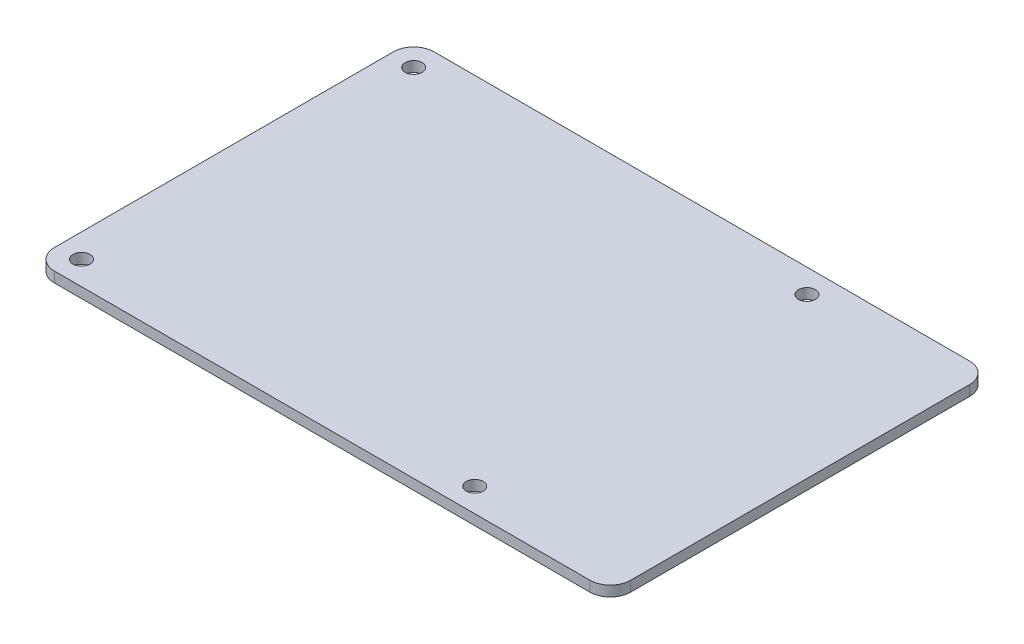
ISO-10303-21;
HEADER;
FILE_DESCRIPTION(('STEP AP214'),'2;1');
FILE_NAME('part.step','',(''),(''),'','','');
FILE_SCHEMA(('AUTOMOTIVE_DESIGN { 1 0 10303 214 1 1 1 1 }'));
ENDSEC;
DATA;
#1=APPLICATION_CONTEXT('core data for automotive mechanical design processes');
#2=APPLICATION_PROTOCOL_DEFINITION('international standard','automotive_design',2000,#1);
#3=PRODUCT_CONTEXT('',#1,'mechanical');
#4=PRODUCT('Part','Part','',(#3));
#5=PRODUCT_RELATED_PRODUCT_CATEGORY('part','',(#4));
#6=PRODUCT_DEFINITION_FORMATION('','',#4);
#7=PRODUCT_DEFINITION_CONTEXT('part definition',#1,'design');
#8=PRODUCT_DEFINITION('design','',#6,#7);
#9=PRODUCT_DEFINITION_SHAPE('','',#8);
#10=(LENGTH_UNIT() NAMED_UNIT(*) SI_UNIT(.MILLI.,.METRE.));
#11=(NAMED_UNIT(*) PLANE_ANGLE_UNIT() SI_UNIT($,.RADIAN.));
#12=(NAMED_UNIT(*) SI_UNIT($,.STERADIAN.) SOLID_ANGLE_UNIT());
#13=UNCERTAINTY_MEASURE_WITH_UNIT(LENGTH_MEASURE(1.E-05),#10,'distance_accuracy_value','');
#14=(GEOMETRIC_REPRESENTATION_CONTEXT(3) GLOBAL_UNCERTAINTY_ASSIGNED_CONTEXT((#13)) GLOBAL_UNIT_ASSIGNED_CONTEXT((#10,
#11,#12)) REPRESENTATION_CONTEXT('',''));
#15=CARTESIAN_POINT('',(0.,0.,0.));
#16=DIRECTION('',(0.,0.,1.));
#17=DIRECTION('',(1.,0.,0.));
#18=AXIS2_PLACEMENT_3D('',#15,#16,#17);
#19=CARTESIAN_POINT('',(0.,1.524,0.));
#20=DIRECTION('',(0.,-1.,0.));
#21=DIRECTION('',(0.,0.,-1.));
#22=AXIS2_PLACEMENT_3D('',#19,#20,#21);
#23=PLANE('',#22);
#24=DIRECTION('',(-1.,0.,0.));
#25=VECTOR('',#24,1.);
#26=CARTESIAN_POINT('',(0.,1.524,-56.));
#27=LINE('',#26,#25);
#28=CARTESIAN_POINT('',(82.,1.524,-56.));
#29=VERTEX_POINT('',#28);
#30=CARTESIAN_POINT('',(3.,1.524,-56.));
#31=VERTEX_POINT('',#30);
#32=EDGE_CURVE('E135',#29,#31,#27,.T.);
#33=ORIENTED_EDGE('',*,*,#32,.T.);
#34=CARTESIAN_POINT('',(3.,1.524,-53.));
#35=DIRECTION('',(0.,-1.,0.));
#36=DIRECTION('',(0.,0.,-1.));
#37=AXIS2_PLACEMENT_3D('',#34,#35,#36);
#38=CIRCLE('',#37,3.);
#39=CARTESIAN_POINT('',(0.,1.524,-53.));
#40=VERTEX_POINT('',#39);
#41=EDGE_CURVE('E154',#31,#40,#38,.F.);
#42=ORIENTED_EDGE('',*,*,#41,.T.);
#43=DIRECTION('',(0.,0.,1.));
#44=VECTOR('',#43,1.);
#45=CARTESIAN_POINT('',(0.,1.524,0.));
#46=LINE('',#45,#44);
#47=CARTESIAN_POINT('',(0.,1.524,-3.));
#48=VERTEX_POINT('',#47);
#49=EDGE_CURVE('E118',#40,#48,#46,.T.);
#50=ORIENTED_EDGE('',*,*,#49,.T.);
#51=CARTESIAN_POINT('',(3.,1.524,-3.));
#52=DIRECTION('',(0.,-1.,0.));
#53=DIRECTION('',(0.,0.,-1.));
#54=AXIS2_PLACEMENT_3D('',#51,#52,#53);
#55=CIRCLE('',#54,3.);
#56=CARTESIAN_POINT('',(3.,1.524,0.));
#57=VERTEX_POINT('',#56);
#58=EDGE_CURVE('E149',#48,#57,#55,.F.);
#59=ORIENTED_EDGE('',*,*,#58,.T.);
#60=DIRECTION('',(1.,0.,0.));
#61=VECTOR('',#60,1.);
#62=CARTESIAN_POINT('',(0.,1.524,0.));
#63=LINE('',#62,#61);
#64=CARTESIAN_POINT('',(82.,1.524,0.));
#65=VERTEX_POINT('',#64);
#66=EDGE_CURVE('E165',#57,#65,#63,.T.);
#67=ORIENTED_EDGE('',*,*,#66,.T.);
#68=CARTESIAN_POINT('',(82.,1.524,-3.));
#69=DIRECTION('',(0.,-1.,0.));
#70=DIRECTION('',(0.,0.,-1.));
#71=AXIS2_PLACEMENT_3D('',#68,#69,#70);
#72=CIRCLE('',#71,3.);
#73=CARTESIAN_POINT('',(85.,1.524,-3.));
#74=VERTEX_POINT('',#73);
#75=EDGE_CURVE('E54',#65,#74,#72,.F.);
#76=ORIENTED_EDGE('',*,*,#75,.T.);
#77=DIRECTION('',(0.,0.,-1.));
#78=VECTOR('',#77,1.);
#79=CARTESIAN_POINT('',(85.,1.524,0.));
#80=LINE('',#79,#78);
#81=CARTESIAN_POINT('',(85.,1.524,-53.));
#82=VERTEX_POINT('',#81);
#83=EDGE_CURVE('E173',#74,#82,#80,.T.);
#84=ORIENTED_EDGE('',*,*,#83,.T.);
#85=CARTESIAN_POINT('',(82.,1.524,-53.));
#86=DIRECTION('',(0.,-1.,0.));
#87=DIRECTION('',(0.,0.,-1.));
#88=AXIS2_PLACEMENT_3D('',#85,#86,#87);
#89=CIRCLE('',#88,3.);
#90=EDGE_CURVE('E152',#82,#29,#89,.F.);
#91=ORIENTED_EDGE('',*,*,#90,.T.);
#92=EDGE_LOOP('',(#33,#42,#50,#59,#67,#76,#84,#91));
#93=FACE_BOUND('',#92,.T.);
#94=CARTESIAN_POINT('',(61.5,1.524,-3.5));
#95=DIRECTION('',(0.,1.,0.));
#96=DIRECTION('',(0.,0.,1.));
#97=AXIS2_PLACEMENT_3D('',#94,#95,#96);
#98=CIRCLE('',#97,1.24999999999999);
#99=CARTESIAN_POINT('',(61.5,1.524,-4.74999999999999));
#100=VERTEX_POINT('',#99);
#101=EDGE_CURVE('E126',#100,#100,#98,.T.);
#102=ORIENTED_EDGE('',*,*,#101,.F.);
#103=EDGE_LOOP('',(#102));
#104=FACE_BOUND('',#103,.T.);
#105=CARTESIAN_POINT('',(61.5,1.524,-52.5));
#106=DIRECTION('',(0.,1.,0.));
#107=DIRECTION('',(0.,0.,1.));
#108=AXIS2_PLACEMENT_3D('',#105,#106,#107);
#109=CIRCLE('',#108,1.24999999999999);
#110=CARTESIAN_POINT('',(61.5,1.524,-53.75));
#111=VERTEX_POINT('',#110);
#112=EDGE_CURVE('E180',#111,#111,#109,.T.);
#113=ORIENTED_EDGE('',*,*,#112,.F.);
#114=EDGE_LOOP('',(#113));
#115=FACE_BOUND('',#114,.T.);
#116=CARTESIAN_POINT('',(3.5,1.524,-3.5));
#117=DIRECTION('',(0.,1.,0.));
#118=DIRECTION('',(0.,0.,1.));
#119=AXIS2_PLACEMENT_3D('',#116,#117,#118);
#120=CIRCLE('',#119,1.25);
#121=CARTESIAN_POINT('',(3.5,1.524,-4.75));
#122=VERTEX_POINT('',#121);
#123=EDGE_CURVE('E185',#122,#122,#120,.T.);
#124=ORIENTED_EDGE('',*,*,#123,.F.);
#125=EDGE_LOOP('',(#124));
#126=FACE_BOUND('',#125,.T.);
#127=CARTESIAN_POINT('',(3.5,1.524,-52.5));
#128=DIRECTION('',(0.,1.,0.));
#129=DIRECTION('',(0.,0.,1.));
#130=AXIS2_PLACEMENT_3D('',#127,#128,#129);
#131=CIRCLE('',#130,1.25);
#132=CARTESIAN_POINT('',(3.5,1.524,-53.75));
#133=VERTEX_POINT('',#132);
#134=EDGE_CURVE('E191',#133,#133,#131,.T.);
#135=ORIENTED_EDGE('',*,*,#134,.F.);
#136=EDGE_LOOP('',(#135));
#137=FACE_BOUND('',#136,.T.);
#138=ADVANCED_FACE('F32',(#93,#104,#115,#126,#137),#23,.F.);
#139=CARTESIAN_POINT('',(0.,0.,0.));
#140=DIRECTION('',(0.,-1.,0.));
#141=DIRECTION('',(0.,0.,-1.));
#142=AXIS2_PLACEMENT_3D('',#139,#140,#141);
#143=PLANE('',#142);
#144=CARTESIAN_POINT('',(3.5,0.,-3.5));
#145=DIRECTION('',(0.,1.,0.));
#146=DIRECTION('',(0.,0.,1.));
#147=AXIS2_PLACEMENT_3D('',#144,#145,#146);
#148=CIRCLE('',#147,1.25);
#149=CARTESIAN_POINT('',(3.5,0.,-4.75));
#150=VERTEX_POINT('',#149);
#151=EDGE_CURVE('E188',#150,#150,#148,.T.);
#152=ORIENTED_EDGE('',*,*,#151,.T.);
#153=EDGE_LOOP('',(#152));
#154=FACE_BOUND('',#153,.T.);
#155=CARTESIAN_POINT('',(61.5,0.,-3.5));
#156=DIRECTION('',(0.,1.,0.));
#157=DIRECTION('',(0.,0.,1.));
#158=AXIS2_PLACEMENT_3D('',#155,#156,#157);
#159=CIRCLE('',#158,1.24999999999999);
#160=CARTESIAN_POINT('',(61.5,0.,-4.74999999999999));
#161=VERTEX_POINT('',#160);
#162=EDGE_CURVE('E132',#161,#161,#159,.T.);
#163=ORIENTED_EDGE('',*,*,#162,.T.);
#164=EDGE_LOOP('',(#163));
#165=FACE_BOUND('',#164,.T.);
#166=DIRECTION('',(0.,0.,1.));
#167=VECTOR('',#166,1.);
#168=CARTESIAN_POINT('',(0.,0.,0.));
#169=LINE('',#168,#167);
#170=CARTESIAN_POINT('',(0.,0.,-53.));
#171=VERTEX_POINT('',#170);
#172=CARTESIAN_POINT('',(0.,0.,-3.));
#173=VERTEX_POINT('',#172);
#174=EDGE_CURVE('E115',#171,#173,#169,.T.);
#175=ORIENTED_EDGE('',*,*,#174,.F.);
#176=CARTESIAN_POINT('',(3.,0.,-53.));
#177=DIRECTION('',(0.,-1.,0.));
#178=DIRECTION('',(0.,0.,-1.));
#179=AXIS2_PLACEMENT_3D('',#176,#177,#178);
#180=CIRCLE('',#179,3.);
#181=CARTESIAN_POINT('',(3.,0.,-56.));
#182=VERTEX_POINT('',#181);
#183=EDGE_CURVE('E98',#171,#182,#180,.T.);
#184=ORIENTED_EDGE('',*,*,#183,.T.);
#185=DIRECTION('',(-1.,0.,0.));
#186=VECTOR('',#185,1.);
#187=CARTESIAN_POINT('',(0.,0.,-56.));
#188=LINE('',#187,#186);
#189=CARTESIAN_POINT('',(82.,0.,-56.));
#190=VERTEX_POINT('',#189);
#191=EDGE_CURVE('E139',#190,#182,#188,.T.);
#192=ORIENTED_EDGE('',*,*,#191,.F.);
#193=CARTESIAN_POINT('',(82.,0.,-53.));
#194=DIRECTION('',(0.,-1.,0.));
#195=DIRECTION('',(0.,0.,-1.));
#196=AXIS2_PLACEMENT_3D('',#193,#194,#195);
#197=CIRCLE('',#196,3.);
#198=CARTESIAN_POINT('',(85.,0.,-53.));
#199=VERTEX_POINT('',#198);
#200=EDGE_CURVE('E109',#190,#199,#197,.T.);
#201=ORIENTED_EDGE('',*,*,#200,.T.);
#202=DIRECTION('',(0.,0.,-1.));
#203=VECTOR('',#202,1.);
#204=CARTESIAN_POINT('',(85.,0.,0.));
#205=LINE('',#204,#203);
#206=CARTESIAN_POINT('',(85.,0.,-3.));
#207=VERTEX_POINT('',#206);
#208=EDGE_CURVE('E129',#207,#199,#205,.T.);
#209=ORIENTED_EDGE('',*,*,#208,.F.);
#210=CARTESIAN_POINT('',(82.,0.,-3.));
#211=DIRECTION('',(0.,-1.,0.));
#212=DIRECTION('',(0.,0.,-1.));
#213=AXIS2_PLACEMENT_3D('',#210,#211,#212);
#214=CIRCLE('',#213,3.);
#215=CARTESIAN_POINT('',(82.,0.,0.));
#216=VERTEX_POINT('',#215);
#217=EDGE_CURVE('E143',#207,#216,#214,.T.);
#218=ORIENTED_EDGE('',*,*,#217,.T.);
#219=DIRECTION('',(1.,0.,0.));
#220=VECTOR('',#219,1.);
#221=CARTESIAN_POINT('',(0.,0.,0.));
#222=LINE('',#221,#220);
#223=CARTESIAN_POINT('',(3.,0.,0.));
#224=VERTEX_POINT('',#223);
#225=EDGE_CURVE('E125',#224,#216,#222,.T.);
#226=ORIENTED_EDGE('',*,*,#225,.F.);
#227=CARTESIAN_POINT('',(3.,0.,-3.));
#228=DIRECTION('',(0.,-1.,0.));
#229=DIRECTION('',(0.,0.,-1.));
#230=AXIS2_PLACEMENT_3D('',#227,#228,#229);
#231=CIRCLE('',#230,3.);
#232=EDGE_CURVE('E119',#224,#173,#231,.T.);
#233=ORIENTED_EDGE('',*,*,#232,.T.);
#234=EDGE_LOOP('',(#175,#184,#192,#201,#209,#218,#226,#233));
#235=FACE_BOUND('',#234,.T.);
#236=CARTESIAN_POINT('',(61.5,0.,-52.5));
#237=DIRECTION('',(0.,1.,0.));
#238=DIRECTION('',(0.,0.,1.));
#239=AXIS2_PLACEMENT_3D('',#236,#237,#238);
#240=CIRCLE('',#239,1.24999999999999);
#241=CARTESIAN_POINT('',(61.5,0.,-53.75));
#242=VERTEX_POINT('',#241);
#243=EDGE_CURVE('E182',#242,#242,#240,.T.);
#244=ORIENTED_EDGE('',*,*,#243,.T.);
#245=EDGE_LOOP('',(#244));
#246=FACE_BOUND('',#245,.T.);
#247=CARTESIAN_POINT('',(3.5,0.,-52.5));
#248=DIRECTION('',(0.,1.,0.));
#249=DIRECTION('',(0.,0.,1.));
#250=AXIS2_PLACEMENT_3D('',#247,#248,#249);
#251=CIRCLE('',#250,1.25);
#252=CARTESIAN_POINT('',(3.5,0.,-53.75));
#253=VERTEX_POINT('',#252);
#254=EDGE_CURVE('E194',#253,#253,#251,.T.);
#255=ORIENTED_EDGE('',*,*,#254,.T.);
#256=EDGE_LOOP('',(#255));
#257=FACE_BOUND('',#256,.T.);
#258=ADVANCED_FACE('F122',(#154,#165,#235,#246,#257),#143,.T.);
#259=CARTESIAN_POINT('',(0.,1.524,0.));
#260=DIRECTION('',(1.,0.,0.));
#261=DIRECTION('',(0.,0.,-1.));
#262=AXIS2_PLACEMENT_3D('',#259,#260,#261);
#263=PLANE('',#262);
#264=ORIENTED_EDGE('',*,*,#49,.F.);
#265=DIRECTION('',(0.,-1.,0.));
#266=VECTOR('',#265,1.);
#267=CARTESIAN_POINT('',(0.,1.524,-53.));
#268=LINE('',#267,#266);
#269=EDGE_CURVE('E102',#40,#171,#268,.T.);
#270=ORIENTED_EDGE('',*,*,#269,.T.);
#271=ORIENTED_EDGE('',*,*,#174,.T.);
#272=DIRECTION('',(0.,-1.,0.));
#273=VECTOR('',#272,1.);
#274=CARTESIAN_POINT('',(0.,1.524,-3.));
#275=LINE('',#274,#273);
#276=EDGE_CURVE('E120',#173,#48,#275,.F.);
#277=ORIENTED_EDGE('',*,*,#276,.T.);
#278=EDGE_LOOP('',(#264,#270,#271,#277));
#279=FACE_BOUND('',#278,.T.);
#280=ADVANCED_FACE('F114',(#279),#263,.F.);
#281=CARTESIAN_POINT('',(0.,1.524,0.));
#282=DIRECTION('',(0.,0.,-1.));
#283=DIRECTION('',(-1.,0.,0.));
#284=AXIS2_PLACEMENT_3D('',#281,#282,#283);
#285=PLANE('',#284);
#286=ORIENTED_EDGE('',*,*,#225,.T.);
#287=DIRECTION('',(0.,-1.,0.));
#288=VECTOR('',#287,1.);
#289=CARTESIAN_POINT('',(82.,1.524,0.));
#290=LINE('',#289,#288);
#291=EDGE_CURVE('E11',#216,#65,#290,.F.);
#292=ORIENTED_EDGE('',*,*,#291,.T.);
#293=ORIENTED_EDGE('',*,*,#66,.F.);
#294=DIRECTION('',(0.,-1.,0.));
#295=VECTOR('',#294,1.);
#296=CARTESIAN_POINT('',(3.,1.524,0.));
#297=LINE('',#296,#295);
#298=EDGE_CURVE('E40',#57,#224,#297,.T.);
#299=ORIENTED_EDGE('',*,*,#298,.T.);
#300=EDGE_LOOP('',(#286,#292,#293,#299));
#301=FACE_BOUND('',#300,.T.);
#302=ADVANCED_FACE('F163',(#301),#285,.F.);
#303=CARTESIAN_POINT('',(85.,1.524,0.));
#304=DIRECTION('',(-1.,0.,0.));
#305=DIRECTION('',(0.,0.,1.));
#306=AXIS2_PLACEMENT_3D('',#303,#304,#305);
#307=PLANE('',#306);
#308=ORIENTED_EDGE('',*,*,#208,.T.);
#309=DIRECTION('',(0.,-1.,0.));
#310=VECTOR('',#309,1.);
#311=CARTESIAN_POINT('',(85.,1.524,-53.));
#312=LINE('',#311,#310);
#313=EDGE_CURVE('E47',#199,#82,#312,.F.);
#314=ORIENTED_EDGE('',*,*,#313,.T.);
#315=ORIENTED_EDGE('',*,*,#83,.F.);
#316=DIRECTION('',(0.,-1.,0.));
#317=VECTOR('',#316,1.);
#318=CARTESIAN_POINT('',(85.,1.524,-3.));
#319=LINE('',#318,#317);
#320=EDGE_CURVE('E156',#74,#207,#319,.T.);
#321=ORIENTED_EDGE('',*,*,#320,.T.);
#322=EDGE_LOOP('',(#308,#314,#315,#321));
#323=FACE_BOUND('',#322,.T.);
#324=ADVANCED_FACE('F172',(#323),#307,.F.);
#325=CARTESIAN_POINT('',(0.,1.524,-56.));
#326=DIRECTION('',(0.,0.,1.));
#327=DIRECTION('',(1.,0.,0.));
#328=AXIS2_PLACEMENT_3D('',#325,#326,#327);
#329=PLANE('',#328);
#330=ORIENTED_EDGE('',*,*,#191,.T.);
#331=DIRECTION('',(0.,-1.,0.));
#332=VECTOR('',#331,1.);
#333=CARTESIAN_POINT('',(3.,1.524,-56.));
#334=LINE('',#333,#332);
#335=EDGE_CURVE('E103',#182,#31,#334,.F.);
#336=ORIENTED_EDGE('',*,*,#335,.T.);
#337=ORIENTED_EDGE('',*,*,#32,.F.);
#338=DIRECTION('',(0.,-1.,0.));
#339=VECTOR('',#338,1.);
#340=CARTESIAN_POINT('',(82.,1.524,-56.));
#341=LINE('',#340,#339);
#342=EDGE_CURVE('E108',#29,#190,#341,.T.);
#343=ORIENTED_EDGE('',*,*,#342,.T.);
#344=EDGE_LOOP('',(#330,#336,#337,#343));
#345=FACE_BOUND('',#344,.T.);
#346=ADVANCED_FACE('F215',(#345),#329,.F.);
#347=CARTESIAN_POINT('',(61.5,1.524,-3.5));
#348=DIRECTION('',(0.,-1.,0.));
#349=DIRECTION('',(0.,0.,-1.));
#350=AXIS2_PLACEMENT_3D('',#347,#348,#349);
#351=CYLINDRICAL_SURFACE('',#350,1.24999999999999);
#352=CARTESIAN_POINT('',(61.5,1.524,-4.74999999999999));
#353=CARTESIAN_POINT('',(61.5,1.508125,-4.74999999999999));
#354=CARTESIAN_POINT('',(61.5,1.49225,-4.74999999999999));
#355=CARTESIAN_POINT('',(61.5,1.4605,-4.74999999999999));
#356=CARTESIAN_POINT('',(61.5,1.444625,-4.74999999999999));
#357=CARTESIAN_POINT('',(61.5,1.412875,-4.74999999999999));
#358=CARTESIAN_POINT('',(61.5,1.397,-4.74999999999999));
#359=CARTESIAN_POINT('',(61.5,1.36525,-4.74999999999999));
#360=CARTESIAN_POINT('',(61.5,1.349375,-4.74999999999999));
#361=CARTESIAN_POINT('',(61.5,1.317625,-4.74999999999999));
#362=CARTESIAN_POINT('',(61.5,1.30175,-4.74999999999999));
#363=CARTESIAN_POINT('',(61.5,1.27,-4.74999999999999));
#364=CARTESIAN_POINT('',(61.5,1.254125,-4.74999999999999));
#365=CARTESIAN_POINT('',(61.5,1.222375,-4.74999999999999));
#366=CARTESIAN_POINT('',(61.5,1.2065,-4.74999999999999));
#367=CARTESIAN_POINT('',(61.5,1.17475,-4.74999999999999));
#368=CARTESIAN_POINT('',(61.5,1.158875,-4.74999999999999));
#369=CARTESIAN_POINT('',(61.5,1.127125,-4.74999999999999));
#370=CARTESIAN_POINT('',(61.5,1.11125,-4.74999999999999));
#371=CARTESIAN_POINT('',(61.5,1.0795,-4.74999999999999));
#372=CARTESIAN_POINT('',(61.5,1.063625,-4.74999999999999));
#373=CARTESIAN_POINT('',(61.5,1.031875,-4.74999999999999));
#374=CARTESIAN_POINT('',(61.5,1.016,-4.74999999999999));
#375=CARTESIAN_POINT('',(61.5,0.98425,-4.74999999999999));
#376=CARTESIAN_POINT('',(61.5,0.968375,-4.74999999999999));
#377=CARTESIAN_POINT('',(61.5,0.936625,-4.74999999999999));
#378=CARTESIAN_POINT('',(61.5,0.92075,-4.74999999999999));
#379=CARTESIAN_POINT('',(61.5,0.889,-4.74999999999999));
#380=CARTESIAN_POINT('',(61.5,0.873125,-4.74999999999999));
#381=CARTESIAN_POINT('',(61.5,0.841375,-4.74999999999999));
#382=CARTESIAN_POINT('',(61.5,0.8255,-4.74999999999999));
#383=CARTESIAN_POINT('',(61.5,0.79375,-4.74999999999999));
#384=CARTESIAN_POINT('',(61.5,0.777875,-4.74999999999999));
#385=CARTESIAN_POINT('',(61.5,0.746125,-4.74999999999999));
#386=CARTESIAN_POINT('',(61.5,0.73025,-4.74999999999999));
#387=CARTESIAN_POINT('',(61.5,0.6985,-4.74999999999999));
#388=CARTESIAN_POINT('',(61.5,0.682625,-4.74999999999999));
#389=CARTESIAN_POINT('',(61.5,0.650875,-4.74999999999999));
#390=CARTESIAN_POINT('',(61.5,0.635,-4.74999999999999));
#391=CARTESIAN_POINT('',(61.5,0.60325,-4.74999999999999));
#392=CARTESIAN_POINT('',(61.5,0.587375,-4.74999999999999));
#393=CARTESIAN_POINT('',(61.5,0.555625,-4.74999999999999));
#394=CARTESIAN_POINT('',(61.5,0.53975,-4.74999999999999));
#395=CARTESIAN_POINT('',(61.5,0.508,-4.74999999999999));
#396=CARTESIAN_POINT('',(61.5,0.492125,-4.74999999999999));
#397=CARTESIAN_POINT('',(61.5,0.460375,-4.74999999999999));
#398=CARTESIAN_POINT('',(61.5,0.4445,-4.74999999999999));
#399=CARTESIAN_POINT('',(61.5,0.41275,-4.74999999999999));
#400=CARTESIAN_POINT('',(61.5,0.396875,-4.74999999999999));
#401=CARTESIAN_POINT('',(61.5,0.365125,-4.74999999999999));
#402=CARTESIAN_POINT('',(61.5,0.34925,-4.74999999999999));
#403=CARTESIAN_POINT('',(61.5,0.3175,-4.74999999999999));
#404=CARTESIAN_POINT('',(61.5,0.301625,-4.74999999999999));
#405=CARTESIAN_POINT('',(61.5,0.269875,-4.74999999999999));
#406=CARTESIAN_POINT('',(61.5,0.254,-4.74999999999999));
#407=CARTESIAN_POINT('',(61.5,0.22225,-4.74999999999999));
#408=CARTESIAN_POINT('',(61.5,0.206375,-4.74999999999999));
#409=CARTESIAN_POINT('',(61.5,0.174625,-4.74999999999999));
#410=CARTESIAN_POINT('',(61.5,0.15875,-4.74999999999999));
#411=CARTESIAN_POINT('',(61.5,0.127,-4.74999999999999));
#412=CARTESIAN_POINT('',(61.5,0.111125,-4.74999999999999));
#413=CARTESIAN_POINT('',(61.5,0.079375,-4.74999999999999));
#414=CARTESIAN_POINT('',(61.5,0.0635,-4.74999999999999));
#415=CARTESIAN_POINT('',(61.5,0.0317499999999999,-4.74999999999999));
#416=CARTESIAN_POINT('',(61.5,0.015875,-4.74999999999999));
#417=CARTESIAN_POINT('',(61.5,0.,-4.74999999999999));
#418=B_SPLINE_CURVE_WITH_KNOTS('',3,(#352,#353,#354,#355,#356,#357,#358,#359,#360,#361,#362,
#363,#364,#365,#366,#367,#368,#369,#370,#371,#372,#373,#374,#375,#376,#377,#378,#379,#380,#381,
#382,#383,#384,#385,#386,#387,#388,#389,#390,#391,#392,#393,#394,#395,#396,#397,#398,#399,#400,
#401,#402,#403,#404,#405,#406,#407,#408,#409,#410,#411,#412,#413,#414,#415,#416,#417),
.UNSPECIFIED.,.F.,.F.,(4,2,2,2,2,2,2,2,2,2,2,2,2,2,2,2,2,2,2,2,2,2,2,2,2,2,2,2,2,2,2,2,4),(0.,
0.0476250000000001,0.0952500000000001,0.142875,0.1905,0.238125,0.28575,0.333375,0.381,0.428625,
0.47625,0.523875,0.5715,0.619125,0.66675,0.714375,0.762,0.809625,0.85725,0.904875,0.9525,
1.000125,1.04775,1.095375,1.143,1.190625,1.23825,1.285875,1.3335,1.381125,1.42875,1.476375,
1.524),.UNSPECIFIED.);
#419=EDGE_CURVE('BSEAM212',#100,#161,#418,.T.);
#420=ORIENTED_EDGE('',*,*,#101,.T.);
#421=ORIENTED_EDGE('',*,*,#162,.F.);
#422=ORIENTED_EDGE('',*,*,#419,.T.);
#423=ORIENTED_EDGE('',*,*,#419,.F.);
#424=EDGE_LOOP('',(#420,#422,#421,#423));
#425=FACE_BOUND('',#424,.T.);
#426=ADVANCED_FACE('F212',(#425),#351,.F.);
#427=CARTESIAN_POINT('',(61.5,1.524,-52.5));
#428=DIRECTION('',(0.,-1.,0.));
#429=DIRECTION('',(0.,0.,-1.));
#430=AXIS2_PLACEMENT_3D('',#427,#428,#429);
#431=CYLINDRICAL_SURFACE('',#430,1.24999999999999);
#432=CARTESIAN_POINT('',(61.5,1.524,-53.75));
#433=CARTESIAN_POINT('',(61.5,1.508125,-53.75));
#434=CARTESIAN_POINT('',(61.5,1.49225,-53.75));
#435=CARTESIAN_POINT('',(61.5,1.4605,-53.75));
#436=CARTESIAN_POINT('',(61.5,1.444625,-53.75));
#437=CARTESIAN_POINT('',(61.5,1.412875,-53.75));
#438=CARTESIAN_POINT('',(61.5,1.397,-53.75));
#439=CARTESIAN_POINT('',(61.5,1.36525,-53.75));
#440=CARTESIAN_POINT('',(61.5,1.349375,-53.75));
#441=CARTESIAN_POINT('',(61.5,1.317625,-53.75));
#442=CARTESIAN_POINT('',(61.5,1.30175,-53.75));
#443=CARTESIAN_POINT('',(61.5,1.27,-53.75));
#444=CARTESIAN_POINT('',(61.5,1.254125,-53.75));
#445=CARTESIAN_POINT('',(61.5,1.222375,-53.75));
#446=CARTESIAN_POINT('',(61.5,1.2065,-53.75));
#447=CARTESIAN_POINT('',(61.5,1.17475,-53.75));
#448=CARTESIAN_POINT('',(61.5,1.158875,-53.75));
#449=CARTESIAN_POINT('',(61.5,1.127125,-53.75));
#450=CARTESIAN_POINT('',(61.5,1.11125,-53.75));
#451=CARTESIAN_POINT('',(61.5,1.0795,-53.75));
#452=CARTESIAN_POINT('',(61.5,1.063625,-53.75));
#453=CARTESIAN_POINT('',(61.5,1.031875,-53.75));
#454=CARTESIAN_POINT('',(61.5,1.016,-53.75));
#455=CARTESIAN_POINT('',(61.5,0.98425,-53.75));
#456=CARTESIAN_POINT('',(61.5,0.968375,-53.75));
#457=CARTESIAN_POINT('',(61.5,0.936625,-53.75));
#458=CARTESIAN_POINT('',(61.5,0.92075,-53.75));
#459=CARTESIAN_POINT('',(61.5,0.889,-53.75));
#460=CARTESIAN_POINT('',(61.5,0.873125,-53.75));
#461=CARTESIAN_POINT('',(61.5,0.841375,-53.75));
#462=CARTESIAN_POINT('',(61.5,0.8255,-53.75));
#463=CARTESIAN_POINT('',(61.5,0.79375,-53.75));
#464=CARTESIAN_POINT('',(61.5,0.777875,-53.75));
#465=CARTESIAN_POINT('',(61.5,0.746125,-53.75));
#466=CARTESIAN_POINT('',(61.5,0.73025,-53.75));
#467=CARTESIAN_POINT('',(61.5,0.6985,-53.75));
#468=CARTESIAN_POINT('',(61.5,0.682625,-53.75));
#469=CARTESIAN_POINT('',(61.5,0.650875,-53.75));
#470=CARTESIAN_POINT('',(61.5,0.635,-53.75));
#471=CARTESIAN_POINT('',(61.5,0.60325,-53.75));
#472=CARTESIAN_POINT('',(61.5,0.587375,-53.75));
#473=CARTESIAN_POINT('',(61.5,0.555625,-53.75));
#474=CARTESIAN_POINT('',(61.5,0.53975,-53.75));
#475=CARTESIAN_POINT('',(61.5,0.508,-53.75));
#476=CARTESIAN_POINT('',(61.5,0.492125,-53.75));
#477=CARTESIAN_POINT('',(61.5,0.460375,-53.75));
#478=CARTESIAN_POINT('',(61.5,0.4445,-53.75));
#479=CARTESIAN_POINT('',(61.5,0.41275,-53.75));
#480=CARTESIAN_POINT('',(61.5,0.396875,-53.75));
#481=CARTESIAN_POINT('',(61.5,0.365125,-53.75));
#482=CARTESIAN_POINT('',(61.5,0.34925,-53.75));
#483=CARTESIAN_POINT('',(61.5,0.3175,-53.75));
#484=CARTESIAN_POINT('',(61.5,0.301625,-53.75));
#485=CARTESIAN_POINT('',(61.5,0.269875,-53.75));
#486=CARTESIAN_POINT('',(61.5,0.254,-53.75));
#487=CARTESIAN_POINT('',(61.5,0.22225,-53.75));
#488=CARTESIAN_POINT('',(61.5,0.206375,-53.75));
#489=CARTESIAN_POINT('',(61.5,0.174625,-53.75));
#490=CARTESIAN_POINT('',(61.5,0.15875,-53.75));
#491=CARTESIAN_POINT('',(61.5,0.127,-53.75));
#492=CARTESIAN_POINT('',(61.5,0.111125,-53.75));
#493=CARTESIAN_POINT('',(61.5,0.079375,-53.75));
#494=CARTESIAN_POINT('',(61.5,0.0635,-53.75));
#495=CARTESIAN_POINT('',(61.5,0.0317499999999999,-53.75));
#496=CARTESIAN_POINT('',(61.5,0.015875,-53.75));
#497=CARTESIAN_POINT('',(61.5,0.,-53.75));
#498=B_SPLINE_CURVE_WITH_KNOTS('',3,(#432,#433,#434,#435,#436,#437,#438,#439,#440,#441,#442,
#443,#444,#445,#446,#447,#448,#449,#450,#451,#452,#453,#454,#455,#456,#457,#458,#459,#460,#461,
#462,#463,#464,#465,#466,#467,#468,#469,#470,#471,#472,#473,#474,#475,#476,#477,#478,#479,#480,
#481,#482,#483,#484,#485,#486,#487,#488,#489,#490,#491,#492,#493,#494,#495,#496,#497),
.UNSPECIFIED.,.F.,.F.,(4,2,2,2,2,2,2,2,2,2,2,2,2,2,2,2,2,2,2,2,2,2,2,2,2,2,2,2,2,2,2,2,4),(0.,
0.0476250000000001,0.0952500000000001,0.142875,0.1905,0.238125,0.28575,0.333375,0.381,0.428625,
0.47625,0.523875,0.5715,0.619125,0.66675,0.714375,0.762,0.809625,0.85725,0.904875,0.9525,
1.000125,1.04775,1.095375,1.143,1.190625,1.23825,1.285875,1.3335,1.381125,1.42875,1.476375,
1.524),.UNSPECIFIED.);
#499=EDGE_CURVE('BSEAM308',#111,#242,#498,.T.);
#500=ORIENTED_EDGE('',*,*,#112,.T.);
#501=ORIENTED_EDGE('',*,*,#243,.F.);
#502=ORIENTED_EDGE('',*,*,#499,.T.);
#503=ORIENTED_EDGE('',*,*,#499,.F.);
#504=EDGE_LOOP('',(#500,#502,#501,#503));
#505=FACE_BOUND('',#504,.T.);
#506=ADVANCED_FACE('F308',(#505),#431,.F.);
#507=CARTESIAN_POINT('',(3.5,1.524,-3.5));
#508=DIRECTION('',(0.,-1.,0.));
#509=DIRECTION('',(0.,0.,-1.));
#510=AXIS2_PLACEMENT_3D('',#507,#508,#509);
#511=CYLINDRICAL_SURFACE('',#510,1.25);
#512=CARTESIAN_POINT('',(3.5,1.524,-4.75));
#513=CARTESIAN_POINT('',(3.5,1.508125,-4.75));
#514=CARTESIAN_POINT('',(3.5,1.49225,-4.75));
#515=CARTESIAN_POINT('',(3.5,1.4605,-4.75));
#516=CARTESIAN_POINT('',(3.5,1.444625,-4.75));
#517=CARTESIAN_POINT('',(3.5,1.412875,-4.75));
#518=CARTESIAN_POINT('',(3.5,1.397,-4.75));
#519=CARTESIAN_POINT('',(3.5,1.36525,-4.75));
#520=CARTESIAN_POINT('',(3.5,1.349375,-4.75));
#521=CARTESIAN_POINT('',(3.5,1.317625,-4.75));
#522=CARTESIAN_POINT('',(3.5,1.30175,-4.75));
#523=CARTESIAN_POINT('',(3.5,1.27,-4.75));
#524=CARTESIAN_POINT('',(3.5,1.254125,-4.75));
#525=CARTESIAN_POINT('',(3.5,1.222375,-4.75));
#526=CARTESIAN_POINT('',(3.5,1.2065,-4.75));
#527=CARTESIAN_POINT('',(3.5,1.17475,-4.75));
#528=CARTESIAN_POINT('',(3.5,1.158875,-4.75));
#529=CARTESIAN_POINT('',(3.5,1.127125,-4.75));
#530=CARTESIAN_POINT('',(3.5,1.11125,-4.75));
#531=CARTESIAN_POINT('',(3.5,1.0795,-4.75));
#532=CARTESIAN_POINT('',(3.5,1.063625,-4.75));
#533=CARTESIAN_POINT('',(3.5,1.031875,-4.75));
#534=CARTESIAN_POINT('',(3.5,1.016,-4.75));
#535=CARTESIAN_POINT('',(3.5,0.98425,-4.75));
#536=CARTESIAN_POINT('',(3.5,0.968375,-4.75));
#537=CARTESIAN_POINT('',(3.5,0.936625,-4.75));
#538=CARTESIAN_POINT('',(3.5,0.92075,-4.75));
#539=CARTESIAN_POINT('',(3.5,0.889,-4.75));
#540=CARTESIAN_POINT('',(3.5,0.873125,-4.75));
#541=CARTESIAN_POINT('',(3.5,0.841375,-4.75));
#542=CARTESIAN_POINT('',(3.5,0.8255,-4.75));
#543=CARTESIAN_POINT('',(3.5,0.79375,-4.75));
#544=CARTESIAN_POINT('',(3.5,0.777875,-4.75));
#545=CARTESIAN_POINT('',(3.5,0.746125,-4.75));
#546=CARTESIAN_POINT('',(3.5,0.73025,-4.75));
#547=CARTESIAN_POINT('',(3.5,0.6985,-4.75));
#548=CARTESIAN_POINT('',(3.5,0.682625,-4.75));
#549=CARTESIAN_POINT('',(3.5,0.650875,-4.75));
#550=CARTESIAN_POINT('',(3.5,0.635,-4.75));
#551=CARTESIAN_POINT('',(3.5,0.60325,-4.75));
#552=CARTESIAN_POINT('',(3.5,0.587375,-4.75));
#553=CARTESIAN_POINT('',(3.5,0.555625,-4.75));
#554=CARTESIAN_POINT('',(3.5,0.53975,-4.75));
#555=CARTESIAN_POINT('',(3.5,0.508,-4.75));
#556=CARTESIAN_POINT('',(3.5,0.492125,-4.75));
#557=CARTESIAN_POINT('',(3.5,0.460375,-4.75));
#558=CARTESIAN_POINT('',(3.5,0.4445,-4.75));
#559=CARTESIAN_POINT('',(3.5,0.41275,-4.75));
#560=CARTESIAN_POINT('',(3.5,0.396875,-4.75));
#561=CARTESIAN_POINT('',(3.5,0.365125,-4.75));
#562=CARTESIAN_POINT('',(3.5,0.34925,-4.75));
#563=CARTESIAN_POINT('',(3.5,0.3175,-4.75));
#564=CARTESIAN_POINT('',(3.5,0.301625,-4.75));
#565=CARTESIAN_POINT('',(3.5,0.269875,-4.75));
#566=CARTESIAN_POINT('',(3.5,0.254,-4.75));
#567=CARTESIAN_POINT('',(3.5,0.22225,-4.75));
#568=CARTESIAN_POINT('',(3.5,0.206375,-4.75));
#569=CARTESIAN_POINT('',(3.5,0.174625,-4.75));
#570=CARTESIAN_POINT('',(3.5,0.15875,-4.75));
#571=CARTESIAN_POINT('',(3.5,0.127,-4.75));
#572=CARTESIAN_POINT('',(3.5,0.111125,-4.75));
#573=CARTESIAN_POINT('',(3.5,0.079375,-4.75));
#574=CARTESIAN_POINT('',(3.5,0.0635,-4.75));
#575=CARTESIAN_POINT('',(3.5,0.0317499999999999,-4.75));
#576=CARTESIAN_POINT('',(3.5,0.015875,-4.75));
#577=CARTESIAN_POINT('',(3.5,0.,-4.75));
#578=B_SPLINE_CURVE_WITH_KNOTS('',3,(#512,#513,#514,#515,#516,#517,#518,#519,#520,#521,#522,
#523,#524,#525,#526,#527,#528,#529,#530,#531,#532,#533,#534,#535,#536,#537,#538,#539,#540,#541,
#542,#543,#544,#545,#546,#547,#548,#549,#550,#551,#552,#553,#554,#555,#556,#557,#558,#559,#560,
#561,#562,#563,#564,#565,#566,#567,#568,#569,#570,#571,#572,#573,#574,#575,#576,#577),
.UNSPECIFIED.,.F.,.F.,(4,2,2,2,2,2,2,2,2,2,2,2,2,2,2,2,2,2,2,2,2,2,2,2,2,2,2,2,2,2,2,2,4),(0.,
0.0476250000000001,0.0952500000000001,0.142875,0.1905,0.238125,0.28575,0.333375,0.381,0.428625,
0.47625,0.523875,0.5715,0.619125,0.66675,0.714375,0.762,0.809625,0.85725,0.904875,0.9525,
1.000125,1.04775,1.095375,1.143,1.190625,1.23825,1.285875,1.3335,1.381125,1.42875,1.476375,
1.524),.UNSPECIFIED.);
#579=EDGE_CURVE('BSEAM299',#122,#150,#578,.T.);
#580=ORIENTED_EDGE('',*,*,#123,.T.);
#581=ORIENTED_EDGE('',*,*,#151,.F.);
#582=ORIENTED_EDGE('',*,*,#579,.T.);
#583=ORIENTED_EDGE('',*,*,#579,.F.);
#584=EDGE_LOOP('',(#580,#582,#581,#583));
#585=FACE_BOUND('',#584,.T.);
#586=ADVANCED_FACE('F299',(#585),#511,.F.);
#587=CARTESIAN_POINT('',(3.5,1.524,-52.5));
#588=DIRECTION('',(0.,-1.,0.));
#589=DIRECTION('',(0.,0.,-1.));
#590=AXIS2_PLACEMENT_3D('',#587,#588,#589);
#591=CYLINDRICAL_SURFACE('',#590,1.25);
#592=CARTESIAN_POINT('',(3.5,1.524,-53.75));
#593=CARTESIAN_POINT('',(3.5,1.508125,-53.75));
#594=CARTESIAN_POINT('',(3.5,1.49225,-53.75));
#595=CARTESIAN_POINT('',(3.5,1.4605,-53.75));
#596=CARTESIAN_POINT('',(3.5,1.444625,-53.75));
#597=CARTESIAN_POINT('',(3.5,1.412875,-53.75));
#598=CARTESIAN_POINT('',(3.5,1.397,-53.75));
#599=CARTESIAN_POINT('',(3.5,1.36525,-53.75));
#600=CARTESIAN_POINT('',(3.5,1.349375,-53.75));
#601=CARTESIAN_POINT('',(3.5,1.317625,-53.75));
#602=CARTESIAN_POINT('',(3.5,1.30175,-53.75));
#603=CARTESIAN_POINT('',(3.5,1.27,-53.75));
#604=CARTESIAN_POINT('',(3.5,1.254125,-53.75));
#605=CARTESIAN_POINT('',(3.5,1.222375,-53.75));
#606=CARTESIAN_POINT('',(3.5,1.2065,-53.75));
#607=CARTESIAN_POINT('',(3.5,1.17475,-53.75));
#608=CARTESIAN_POINT('',(3.5,1.158875,-53.75));
#609=CARTESIAN_POINT('',(3.5,1.127125,-53.75));
#610=CARTESIAN_POINT('',(3.5,1.11125,-53.75));
#611=CARTESIAN_POINT('',(3.5,1.0795,-53.75));
#612=CARTESIAN_POINT('',(3.5,1.063625,-53.75));
#613=CARTESIAN_POINT('',(3.5,1.031875,-53.75));
#614=CARTESIAN_POINT('',(3.5,1.016,-53.75));
#615=CARTESIAN_POINT('',(3.5,0.98425,-53.75));
#616=CARTESIAN_POINT('',(3.5,0.968375,-53.75));
#617=CARTESIAN_POINT('',(3.5,0.936625,-53.75));
#618=CARTESIAN_POINT('',(3.5,0.92075,-53.75));
#619=CARTESIAN_POINT('',(3.5,0.889,-53.75));
#620=CARTESIAN_POINT('',(3.5,0.873125,-53.75));
#621=CARTESIAN_POINT('',(3.5,0.841375,-53.75));
#622=CARTESIAN_POINT('',(3.5,0.8255,-53.75));
#623=CARTESIAN_POINT('',(3.5,0.79375,-53.75));
#624=CARTESIAN_POINT('',(3.5,0.777875,-53.75));
#625=CARTESIAN_POINT('',(3.5,0.746125,-53.75));
#626=CARTESIAN_POINT('',(3.5,0.73025,-53.75));
#627=CARTESIAN_POINT('',(3.5,0.6985,-53.75));
#628=CARTESIAN_POINT('',(3.5,0.682625,-53.75));
#629=CARTESIAN_POINT('',(3.5,0.650875,-53.75));
#630=CARTESIAN_POINT('',(3.5,0.635,-53.75));
#631=CARTESIAN_POINT('',(3.5,0.60325,-53.75));
#632=CARTESIAN_POINT('',(3.5,0.587375,-53.75));
#633=CARTESIAN_POINT('',(3.5,0.555625,-53.75));
#634=CARTESIAN_POINT('',(3.5,0.53975,-53.75));
#635=CARTESIAN_POINT('',(3.5,0.508,-53.75));
#636=CARTESIAN_POINT('',(3.5,0.492125,-53.75));
#637=CARTESIAN_POINT('',(3.5,0.460375,-53.75));
#638=CARTESIAN_POINT('',(3.5,0.4445,-53.75));
#639=CARTESIAN_POINT('',(3.5,0.41275,-53.75));
#640=CARTESIAN_POINT('',(3.5,0.396875,-53.75));
#641=CARTESIAN_POINT('',(3.5,0.365125,-53.75));
#642=CARTESIAN_POINT('',(3.5,0.34925,-53.75));
#643=CARTESIAN_POINT('',(3.5,0.3175,-53.75));
#644=CARTESIAN_POINT('',(3.5,0.301625,-53.75));
#645=CARTESIAN_POINT('',(3.5,0.269875,-53.75));
#646=CARTESIAN_POINT('',(3.5,0.254,-53.75));
#647=CARTESIAN_POINT('',(3.5,0.22225,-53.75));
#648=CARTESIAN_POINT('',(3.5,0.206375,-53.75));
#649=CARTESIAN_POINT('',(3.5,0.174625,-53.75));
#650=CARTESIAN_POINT('',(3.5,0.15875,-53.75));
#651=CARTESIAN_POINT('',(3.5,0.127,-53.75));
#652=CARTESIAN_POINT('',(3.5,0.111125,-53.75));
#653=CARTESIAN_POINT('',(3.5,0.079375,-53.75));
#654=CARTESIAN_POINT('',(3.5,0.0635,-53.75));
#655=CARTESIAN_POINT('',(3.5,0.0317499999999999,-53.75));
#656=CARTESIAN_POINT('',(3.5,0.015875,-53.75));
#657=CARTESIAN_POINT('',(3.5,0.,-53.75));
#658=B_SPLINE_CURVE_WITH_KNOTS('',3,(#592,#593,#594,#595,#596,#597,#598,#599,#600,#601,#602,
#603,#604,#605,#606,#607,#608,#609,#610,#611,#612,#613,#614,#615,#616,#617,#618,#619,#620,#621,
#622,#623,#624,#625,#626,#627,#628,#629,#630,#631,#632,#633,#634,#635,#636,#637,#638,#639,#640,
#641,#642,#643,#644,#645,#646,#647,#648,#649,#650,#651,#652,#653,#654,#655,#656,#657),
.UNSPECIFIED.,.F.,.F.,(4,2,2,2,2,2,2,2,2,2,2,2,2,2,2,2,2,2,2,2,2,2,2,2,2,2,2,2,2,2,2,2,4),(0.,
0.0476250000000001,0.0952500000000001,0.142875,0.1905,0.238125,0.28575,0.333375,0.381,0.428625,
0.47625,0.523875,0.5715,0.619125,0.66675,0.714375,0.762,0.809625,0.85725,0.904875,0.9525,
1.000125,1.04775,1.095375,1.143,1.190625,1.23825,1.285875,1.3335,1.381125,1.42875,1.476375,
1.524),.UNSPECIFIED.);
#659=EDGE_CURVE('BSEAM200',#133,#253,#658,.T.);
#660=ORIENTED_EDGE('',*,*,#134,.T.);
#661=ORIENTED_EDGE('',*,*,#254,.F.);
#662=ORIENTED_EDGE('',*,*,#659,.T.);
#663=ORIENTED_EDGE('',*,*,#659,.F.);
#664=EDGE_LOOP('',(#660,#662,#661,#663));
#665=FACE_BOUND('',#664,.T.);
#666=ADVANCED_FACE('F200',(#665),#591,.F.);
#667=CARTESIAN_POINT('',(3.,1.524,-53.));
#668=DIRECTION('',(0.,-1.,0.));
#669=DIRECTION('',(0.,0.,-1.));
#670=AXIS2_PLACEMENT_3D('',#667,#668,#669);
#671=CYLINDRICAL_SURFACE('',#670,3.);
#672=ORIENTED_EDGE('',*,*,#41,.F.);
#673=ORIENTED_EDGE('',*,*,#335,.F.);
#674=ORIENTED_EDGE('',*,*,#183,.F.);
#675=ORIENTED_EDGE('',*,*,#269,.F.);
#676=EDGE_LOOP('',(#672,#673,#674,#675));
#677=FACE_BOUND('',#676,.T.);
#678=ADVANCED_FACE('F101',(#677),#671,.T.);
#679=CARTESIAN_POINT('',(82.,1.524,-53.));
#680=DIRECTION('',(0.,-1.,0.));
#681=DIRECTION('',(0.,0.,-1.));
#682=AXIS2_PLACEMENT_3D('',#679,#680,#681);
#683=CYLINDRICAL_SURFACE('',#682,3.);
#684=ORIENTED_EDGE('',*,*,#90,.F.);
#685=ORIENTED_EDGE('',*,*,#313,.F.);
#686=ORIENTED_EDGE('',*,*,#200,.F.);
#687=ORIENTED_EDGE('',*,*,#342,.F.);
#688=EDGE_LOOP('',(#684,#685,#686,#687));
#689=FACE_BOUND('',#688,.T.);
#690=ADVANCED_FACE('F227',(#689),#683,.T.);
#691=CARTESIAN_POINT('',(82.,1.524,-3.));
#692=DIRECTION('',(0.,-1.,0.));
#693=DIRECTION('',(0.,0.,-1.));
#694=AXIS2_PLACEMENT_3D('',#691,#692,#693);
#695=CYLINDRICAL_SURFACE('',#694,3.);
#696=ORIENTED_EDGE('',*,*,#75,.F.);
#697=ORIENTED_EDGE('',*,*,#291,.F.);
#698=ORIENTED_EDGE('',*,*,#217,.F.);
#699=ORIENTED_EDGE('',*,*,#320,.F.);
#700=EDGE_LOOP('',(#696,#697,#698,#699));
#701=FACE_BOUND('',#700,.T.);
#702=ADVANCED_FACE('F171',(#701),#695,.T.);
#703=CARTESIAN_POINT('',(3.,1.524,-3.));
#704=DIRECTION('',(0.,-1.,0.));
#705=DIRECTION('',(0.,0.,-1.));
#706=AXIS2_PLACEMENT_3D('',#703,#704,#705);
#707=CYLINDRICAL_SURFACE('',#706,3.);
#708=ORIENTED_EDGE('',*,*,#58,.F.);
#709=ORIENTED_EDGE('',*,*,#276,.F.);
#710=ORIENTED_EDGE('',*,*,#232,.F.);
#711=ORIENTED_EDGE('',*,*,#298,.F.);
#712=EDGE_LOOP('',(#708,#709,#710,#711));
#713=FACE_BOUND('',#712,.T.);
#714=ADVANCED_FACE('F34',(#713),#707,.T.);
#715=CLOSED_SHELL('',(#138,#258,#280,#302,#324,#346,#426,#506,#586,#666,#678,#690,#702,#714));
#716=MANIFOLD_SOLID_BREP('B2',#715);
#717=ADVANCED_BREP_SHAPE_REPRESENTATION('',(#18,#716),#14);
#718=SHAPE_DEFINITION_REPRESENTATION(#9,#717);
ENDSEC;
END-ISO-10303-21;
